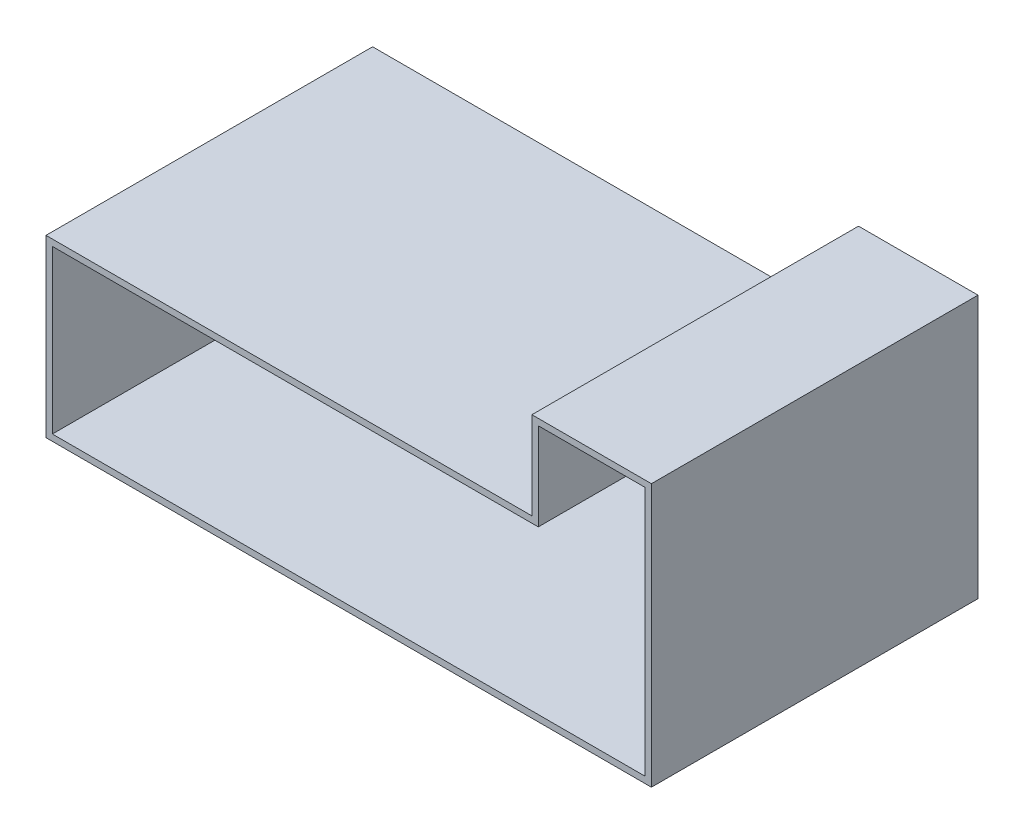
ISO-10303-21;
HEADER;
FILE_DESCRIPTION(('STEP AP214'),'2;1');
FILE_NAME('part.step','',(''),(''),'','','');
FILE_SCHEMA(('AUTOMOTIVE_DESIGN { 1 0 10303 214 1 1 1 1 }'));
ENDSEC;
DATA;
#1=APPLICATION_CONTEXT('core data for automotive mechanical design processes');
#2=APPLICATION_PROTOCOL_DEFINITION('international standard','automotive_design',2000,#1);
#3=PRODUCT_CONTEXT('',#1,'mechanical');
#4=PRODUCT('Part','Part','',(#3));
#5=PRODUCT_RELATED_PRODUCT_CATEGORY('part','',(#4));
#6=PRODUCT_DEFINITION_FORMATION('','',#4);
#7=PRODUCT_DEFINITION_CONTEXT('part definition',#1,'design');
#8=PRODUCT_DEFINITION('design','',#6,#7);
#9=PRODUCT_DEFINITION_SHAPE('','',#8);
#10=(LENGTH_UNIT() NAMED_UNIT(*) SI_UNIT(.MILLI.,.METRE.));
#11=(NAMED_UNIT(*) PLANE_ANGLE_UNIT() SI_UNIT($,.RADIAN.));
#12=(NAMED_UNIT(*) SI_UNIT($,.STERADIAN.) SOLID_ANGLE_UNIT());
#13=UNCERTAINTY_MEASURE_WITH_UNIT(LENGTH_MEASURE(1.E-05),#10,'distance_accuracy_value','');
#14=(GEOMETRIC_REPRESENTATION_CONTEXT(3) GLOBAL_UNCERTAINTY_ASSIGNED_CONTEXT((#13)) GLOBAL_UNIT_ASSIGNED_CONTEXT((#10,
#11,#12)) REPRESENTATION_CONTEXT('',''));
#15=CARTESIAN_POINT('',(0.,0.,0.));
#16=DIRECTION('',(0.,0.,1.));
#17=DIRECTION('',(1.,0.,0.));
#18=AXIS2_PLACEMENT_3D('',#15,#16,#17);
#19=CARTESIAN_POINT('',(-515.221238938053,220.,-96.1504424778762));
#20=DIRECTION('',(1.,0.,0.));
#21=DIRECTION('',(0.,0.,-1.));
#22=AXIS2_PLACEMENT_3D('',#19,#20,#21);
#23=PLANE('',#22);
#24=DIRECTION('',(0.,0.,1.));
#25=VECTOR('',#24,1.);
#26=CARTESIAN_POINT('',(-515.221238938053,0.,-96.1504424778762));
#27=LINE('',#26,#25);
#28=CARTESIAN_POINT('',(-515.221238938053,0.,-96.1504424778762));
#29=VERTEX_POINT('',#28);
#30=CARTESIAN_POINT('',(-515.221238938053,0.,313.849557522124));
#31=VERTEX_POINT('',#30);
#32=EDGE_CURVE('E217',#29,#31,#27,.T.);
#33=ORIENTED_EDGE('',*,*,#32,.T.);
#34=DIRECTION('',(0.,-1.,0.));
#35=VECTOR('',#34,1.);
#36=CARTESIAN_POINT('',(-515.221238938053,220.,313.849557522124));
#37=LINE('',#36,#35);
#38=CARTESIAN_POINT('',(-515.221238938053,220.,313.849557522124));
#39=VERTEX_POINT('',#38);
#40=EDGE_CURVE('E11',#39,#31,#37,.T.);
#41=ORIENTED_EDGE('',*,*,#40,.F.);
#42=DIRECTION('',(0.,0.,1.));
#43=VECTOR('',#42,1.);
#44=CARTESIAN_POINT('',(-515.221238938053,220.,-96.1504424778762));
#45=LINE('',#44,#43);
#46=CARTESIAN_POINT('',(-515.221238938053,220.,-96.1504424778762));
#47=VERTEX_POINT('',#46);
#48=EDGE_CURVE('E218',#47,#39,#45,.T.);
#49=ORIENTED_EDGE('',*,*,#48,.F.);
#50=DIRECTION('',(0.,-1.,0.));
#51=VECTOR('',#50,1.);
#52=CARTESIAN_POINT('',(-515.221238938053,220.,-96.1504424778762));
#53=LINE('',#52,#51);
#54=EDGE_CURVE('E46',#47,#29,#53,.T.);
#55=ORIENTED_EDGE('',*,*,#54,.T.);
#56=EDGE_LOOP('',(#33,#41,#49,#55));
#57=FACE_BOUND('',#56,.T.);
#58=ADVANCED_FACE('F38',(#57),#23,.F.);
#59=CARTESIAN_POINT('',(-515.221238938053,220.,313.849557522124));
#60=DIRECTION('',(0.,0.,-1.));
#61=DIRECTION('',(-1.,0.,0.));
#62=AXIS2_PLACEMENT_3D('',#59,#60,#61);
#63=PLANE('',#62);
#64=DIRECTION('',(-1.,0.,0.));
#65=VECTOR('',#64,1.);
#66=CARTESIAN_POINT('',(-507.221238938053,212.,313.849557522124));
#67=LINE('',#66,#65);
#68=CARTESIAN_POINT('',(102.778761061947,212.,313.849557522124));
#69=VERTEX_POINT('',#68);
#70=CARTESIAN_POINT('',(-507.221238938053,212.,313.849557522124));
#71=VERTEX_POINT('',#70);
#72=EDGE_CURVE('E181',#69,#71,#67,.T.);
#73=ORIENTED_EDGE('',*,*,#72,.F.);
#74=DIRECTION('',(0.,-1.,0.));
#75=VECTOR('',#74,1.);
#76=CARTESIAN_POINT('',(102.778761061947,322.,313.849557522124));
#77=LINE('',#76,#75);
#78=CARTESIAN_POINT('',(102.778761061947,322.,313.849557522124));
#79=VERTEX_POINT('',#78);
#80=EDGE_CURVE('E144',#79,#69,#77,.T.);
#81=ORIENTED_EDGE('',*,*,#80,.F.);
#82=DIRECTION('',(-1.,0.,0.));
#83=VECTOR('',#82,1.);
#84=CARTESIAN_POINT('',(102.778761061947,322.,313.849557522124));
#85=LINE('',#84,#83);
#86=CARTESIAN_POINT('',(236.778761061947,322.,313.849557522124));
#87=VERTEX_POINT('',#86);
#88=EDGE_CURVE('E159',#87,#79,#85,.T.);
#89=ORIENTED_EDGE('',*,*,#88,.F.);
#90=DIRECTION('',(0.,1.,0.));
#91=VECTOR('',#90,1.);
#92=CARTESIAN_POINT('',(236.778761061947,212.,313.849557522124));
#93=LINE('',#92,#91);
#94=CARTESIAN_POINT('',(236.778761061947,8.00000000000001,313.849557522124));
#95=VERTEX_POINT('',#94);
#96=EDGE_CURVE('E307',#95,#87,#93,.T.);
#97=ORIENTED_EDGE('',*,*,#96,.F.);
#98=DIRECTION('',(1.,0.,0.));
#99=VECTOR('',#98,1.);
#100=CARTESIAN_POINT('',(-507.221238938053,8.00000000000001,313.849557522124));
#101=LINE('',#100,#99);
#102=CARTESIAN_POINT('',(-507.221238938053,8.00000000000001,313.849557522124));
#103=VERTEX_POINT('',#102);
#104=EDGE_CURVE('E177',#103,#95,#101,.T.);
#105=ORIENTED_EDGE('',*,*,#104,.F.);
#106=DIRECTION('',(0.,-1.,0.));
#107=VECTOR('',#106,1.);
#108=CARTESIAN_POINT('',(-507.221238938053,212.,313.849557522124));
#109=LINE('',#108,#107);
#110=EDGE_CURVE('E53',#71,#103,#109,.T.);
#111=ORIENTED_EDGE('',*,*,#110,.F.);
#112=EDGE_LOOP('',(#73,#81,#89,#97,#105,#111));
#113=FACE_BOUND('',#112,.T.);
#114=DIRECTION('',(1.,0.,0.));
#115=VECTOR('',#114,1.);
#116=CARTESIAN_POINT('',(-515.221238938053,0.,313.849557522124));
#117=LINE('',#116,#115);
#118=CARTESIAN_POINT('',(244.778761061947,0.,313.849557522124));
#119=VERTEX_POINT('',#118);
#120=EDGE_CURVE('E231',#31,#119,#117,.T.);
#121=ORIENTED_EDGE('',*,*,#120,.T.);
#122=DIRECTION('',(0.,-1.,0.));
#123=VECTOR('',#122,1.);
#124=CARTESIAN_POINT('',(244.778761061947,330.,313.849557522124));
#125=LINE('',#124,#123);
#126=CARTESIAN_POINT('',(244.778761061947,330.,313.849557522124));
#127=VERTEX_POINT('',#126);
#128=EDGE_CURVE('E187',#127,#119,#125,.T.);
#129=ORIENTED_EDGE('',*,*,#128,.F.);
#130=DIRECTION('',(-1.,0.,0.));
#131=VECTOR('',#130,1.);
#132=CARTESIAN_POINT('',(244.778761061947,330.,313.849557522124));
#133=LINE('',#132,#131);
#134=CARTESIAN_POINT('',(94.7787610619469,330.,313.849557522124));
#135=VERTEX_POINT('',#134);
#136=EDGE_CURVE('E202',#127,#135,#133,.T.);
#137=ORIENTED_EDGE('',*,*,#136,.T.);
#138=DIRECTION('',(0.,-1.,0.));
#139=VECTOR('',#138,1.);
#140=CARTESIAN_POINT('',(94.7787610619469,330.,313.849557522124));
#141=LINE('',#140,#139);
#142=CARTESIAN_POINT('',(94.7787610619469,220.,313.849557522124));
#143=VERTEX_POINT('',#142);
#144=EDGE_CURVE('E185',#135,#143,#141,.T.);
#145=ORIENTED_EDGE('',*,*,#144,.T.);
#146=DIRECTION('',(1.,0.,0.));
#147=VECTOR('',#146,1.);
#148=CARTESIAN_POINT('',(-515.221238938053,220.,313.849557522124));
#149=LINE('',#148,#147);
#150=EDGE_CURVE('E83',#39,#143,#149,.T.);
#151=ORIENTED_EDGE('',*,*,#150,.F.);
#152=ORIENTED_EDGE('',*,*,#40,.T.);
#153=EDGE_LOOP('',(#121,#129,#137,#145,#151,#152));
#154=FACE_BOUND('',#153,.T.);
#155=ADVANCED_FACE('F244',(#113,#154),#63,.F.);
#156=CARTESIAN_POINT('',(-515.221238938053,220.,-96.1504424778762));
#157=DIRECTION('',(0.,0.,1.));
#158=DIRECTION('',(1.,0.,0.));
#159=AXIS2_PLACEMENT_3D('',#156,#157,#158);
#160=PLANE('',#159);
#161=DIRECTION('',(-1.,0.,0.));
#162=VECTOR('',#161,1.);
#163=CARTESIAN_POINT('',(-515.221238938053,0.,-96.1504424778762));
#164=LINE('',#163,#162);
#165=CARTESIAN_POINT('',(244.778761061947,0.,-96.1504424778762));
#166=VERTEX_POINT('',#165);
#167=EDGE_CURVE('E77',#166,#29,#164,.T.);
#168=ORIENTED_EDGE('',*,*,#167,.T.);
#169=ORIENTED_EDGE('',*,*,#54,.F.);
#170=DIRECTION('',(-1.,0.,0.));
#171=VECTOR('',#170,1.);
#172=CARTESIAN_POINT('',(-515.221238938053,220.,-96.1504424778762));
#173=LINE('',#172,#171);
#174=CARTESIAN_POINT('',(94.7787610619469,220.,-96.1504424778762));
#175=VERTEX_POINT('',#174);
#176=EDGE_CURVE('E62',#175,#47,#173,.T.);
#177=ORIENTED_EDGE('',*,*,#176,.F.);
#178=DIRECTION('',(0.,1.,0.));
#179=VECTOR('',#178,1.);
#180=CARTESIAN_POINT('',(94.7787610619469,330.,-96.1504424778761));
#181=LINE('',#180,#179);
#182=CARTESIAN_POINT('',(94.7787610619469,330.,-96.1504424778761));
#183=VERTEX_POINT('',#182);
#184=EDGE_CURVE('E205',#175,#183,#181,.T.);
#185=ORIENTED_EDGE('',*,*,#184,.T.);
#186=DIRECTION('',(-1.,0.,0.));
#187=VECTOR('',#186,1.);
#188=CARTESIAN_POINT('',(244.778761061947,330.,-96.1504424778761));
#189=LINE('',#188,#187);
#190=CARTESIAN_POINT('',(244.778761061947,330.,-96.1504424778761));
#191=VERTEX_POINT('',#190);
#192=EDGE_CURVE('E213',#191,#183,#189,.T.);
#193=ORIENTED_EDGE('',*,*,#192,.F.);
#194=DIRECTION('',(0.,1.,0.));
#195=VECTOR('',#194,1.);
#196=CARTESIAN_POINT('',(244.778761061947,330.,-96.1504424778761));
#197=LINE('',#196,#195);
#198=EDGE_CURVE('E196',#166,#191,#197,.T.);
#199=ORIENTED_EDGE('',*,*,#198,.F.);
#200=EDGE_LOOP('',(#168,#169,#177,#185,#193,#199));
#201=FACE_BOUND('',#200,.T.);
#202=ADVANCED_FACE('F246',(#201),#160,.F.);
#203=CARTESIAN_POINT('',(0.,220.,0.));
#204=DIRECTION('',(0.,1.,0.));
#205=DIRECTION('',(0.,0.,1.));
#206=AXIS2_PLACEMENT_3D('',#203,#204,#205);
#207=PLANE('',#206);
#208=ORIENTED_EDGE('',*,*,#48,.T.);
#209=ORIENTED_EDGE('',*,*,#150,.T.);
#210=DIRECTION('',(0.,0.,-1.));
#211=VECTOR('',#210,1.);
#212=CARTESIAN_POINT('',(94.7787610619469,220.,-96.1504424778762));
#213=LINE('',#212,#211);
#214=EDGE_CURVE('E223',#143,#175,#213,.T.);
#215=ORIENTED_EDGE('',*,*,#214,.T.);
#216=ORIENTED_EDGE('',*,*,#176,.T.);
#217=EDGE_LOOP('',(#208,#209,#215,#216));
#218=FACE_BOUND('',#217,.T.);
#219=ADVANCED_FACE('F252',(#218),#207,.T.);
#220=CARTESIAN_POINT('',(0.,0.,0.));
#221=DIRECTION('',(0.,1.,0.));
#222=DIRECTION('',(0.,0.,1.));
#223=AXIS2_PLACEMENT_3D('',#220,#221,#222);
#224=PLANE('',#223);
#225=ORIENTED_EDGE('',*,*,#32,.F.);
#226=ORIENTED_EDGE('',*,*,#167,.F.);
#227=DIRECTION('',(0.,0.,-1.));
#228=VECTOR('',#227,1.);
#229=CARTESIAN_POINT('',(244.778761061947,0.,313.849557522124));
#230=LINE('',#229,#228);
#231=EDGE_CURVE('E191',#119,#166,#230,.T.);
#232=ORIENTED_EDGE('',*,*,#231,.F.);
#233=ORIENTED_EDGE('',*,*,#120,.F.);
#234=EDGE_LOOP('',(#225,#226,#232,#233));
#235=FACE_BOUND('',#234,.T.);
#236=ADVANCED_FACE('F241',(#235),#224,.F.);
#237=CARTESIAN_POINT('',(244.778761061947,330.,313.849557522124));
#238=DIRECTION('',(0.,-1.,0.));
#239=DIRECTION('',(0.,0.,-1.));
#240=AXIS2_PLACEMENT_3D('',#237,#238,#239);
#241=PLANE('',#240);
#242=DIRECTION('',(0.,0.,1.));
#243=VECTOR('',#242,1.);
#244=CARTESIAN_POINT('',(94.7787610619469,330.,313.849557522124));
#245=LINE('',#244,#243);
#246=EDGE_CURVE('E192',#183,#135,#245,.T.);
#247=ORIENTED_EDGE('',*,*,#246,.T.);
#248=ORIENTED_EDGE('',*,*,#136,.F.);
#249=DIRECTION('',(0.,0.,1.));
#250=VECTOR('',#249,1.);
#251=CARTESIAN_POINT('',(244.778761061947,330.,313.849557522124));
#252=LINE('',#251,#250);
#253=EDGE_CURVE('E199',#191,#127,#252,.T.);
#254=ORIENTED_EDGE('',*,*,#253,.F.);
#255=ORIENTED_EDGE('',*,*,#192,.T.);
#256=EDGE_LOOP('',(#247,#248,#254,#255));
#257=FACE_BOUND('',#256,.T.);
#258=ADVANCED_FACE('F257',(#257),#241,.F.);
#259=CARTESIAN_POINT('',(244.778761061947,0.,0.));
#260=DIRECTION('',(1.,0.,0.));
#261=DIRECTION('',(0.,0.,-1.));
#262=AXIS2_PLACEMENT_3D('',#259,#260,#261);
#263=PLANE('',#262);
#264=ORIENTED_EDGE('',*,*,#128,.T.);
#265=ORIENTED_EDGE('',*,*,#231,.T.);
#266=ORIENTED_EDGE('',*,*,#198,.T.);
#267=ORIENTED_EDGE('',*,*,#253,.T.);
#268=EDGE_LOOP('',(#264,#265,#266,#267));
#269=FACE_BOUND('',#268,.T.);
#270=ADVANCED_FACE('F262',(#269),#263,.T.);
#271=CARTESIAN_POINT('',(94.7787610619469,0.,0.));
#272=DIRECTION('',(1.,0.,0.));
#273=DIRECTION('',(0.,0.,-1.));
#274=AXIS2_PLACEMENT_3D('',#271,#272,#273);
#275=PLANE('',#274);
#276=ORIENTED_EDGE('',*,*,#214,.F.);
#277=ORIENTED_EDGE('',*,*,#144,.F.);
#278=ORIENTED_EDGE('',*,*,#246,.F.);
#279=ORIENTED_EDGE('',*,*,#184,.F.);
#280=EDGE_LOOP('',(#276,#277,#278,#279));
#281=FACE_BOUND('',#280,.T.);
#282=ADVANCED_FACE('F264',(#281),#275,.F.);
#283=CARTESIAN_POINT('',(-507.221238938053,212.,-88.1504424778762));
#284=DIRECTION('',(-1.,0.,0.));
#285=DIRECTION('',(0.,0.,1.));
#286=AXIS2_PLACEMENT_3D('',#283,#284,#285);
#287=PLANE('',#286);
#288=ORIENTED_EDGE('',*,*,#110,.T.);
#289=DIRECTION('',(0.,0.,1.));
#290=VECTOR('',#289,1.);
#291=CARTESIAN_POINT('',(-507.221238938053,8.00000000000001,-88.1504424778762));
#292=LINE('',#291,#290);
#293=CARTESIAN_POINT('',(-507.221238938053,8.00000000000001,-88.1504424778762));
#294=VERTEX_POINT('',#293);
#295=EDGE_CURVE('E165',#294,#103,#292,.T.);
#296=ORIENTED_EDGE('',*,*,#295,.F.);
#297=DIRECTION('',(0.,-1.,0.));
#298=VECTOR('',#297,1.);
#299=CARTESIAN_POINT('',(-507.221238938053,212.,-88.1504424778762));
#300=LINE('',#299,#298);
#301=CARTESIAN_POINT('',(-507.221238938053,212.,-88.1504424778762));
#302=VERTEX_POINT('',#301);
#303=EDGE_CURVE('E171',#302,#294,#300,.T.);
#304=ORIENTED_EDGE('',*,*,#303,.F.);
#305=DIRECTION('',(0.,0.,1.));
#306=VECTOR('',#305,1.);
#307=CARTESIAN_POINT('',(-507.221238938053,212.,-88.1504424778762));
#308=LINE('',#307,#306);
#309=EDGE_CURVE('E162',#302,#71,#308,.T.);
#310=ORIENTED_EDGE('',*,*,#309,.T.);
#311=EDGE_LOOP('',(#288,#296,#304,#310));
#312=FACE_BOUND('',#311,.T.);
#313=ADVANCED_FACE('F267',(#312),#287,.F.);
#314=CARTESIAN_POINT('',(-507.221238938053,212.,-88.1504424778762));
#315=DIRECTION('',(0.,1.,0.));
#316=DIRECTION('',(-1.,0.,0.));
#317=AXIS2_PLACEMENT_3D('',#314,#315,#316);
#318=PLANE('',#317);
#319=DIRECTION('',(-1.,0.,0.));
#320=VECTOR('',#319,1.);
#321=CARTESIAN_POINT('',(-507.221238938053,212.,-88.1504424778762));
#322=LINE('',#321,#320);
#323=CARTESIAN_POINT('',(102.778761061947,212.,-88.1504424778762));
#324=VERTEX_POINT('',#323);
#325=EDGE_CURVE('E155',#324,#302,#322,.T.);
#326=ORIENTED_EDGE('',*,*,#325,.F.);
#327=DIRECTION('',(0.,0.,1.));
#328=VECTOR('',#327,1.);
#329=CARTESIAN_POINT('',(102.778761061947,212.,-88.1504424778762));
#330=LINE('',#329,#328);
#331=EDGE_CURVE('E138',#324,#69,#330,.T.);
#332=ORIENTED_EDGE('',*,*,#331,.T.);
#333=ORIENTED_EDGE('',*,*,#72,.T.);
#334=ORIENTED_EDGE('',*,*,#309,.F.);
#335=EDGE_LOOP('',(#326,#332,#333,#334));
#336=FACE_BOUND('',#335,.T.);
#337=ADVANCED_FACE('F161',(#336),#318,.F.);
#338=CARTESIAN_POINT('',(-507.221238938053,8.00000000000001,-88.1504424778762));
#339=DIRECTION('',(0.,-1.,0.));
#340=DIRECTION('',(0.,0.,-1.));
#341=AXIS2_PLACEMENT_3D('',#338,#339,#340);
#342=PLANE('',#341);
#343=ORIENTED_EDGE('',*,*,#104,.T.);
#344=DIRECTION('',(0.,0.,1.));
#345=VECTOR('',#344,1.);
#346=CARTESIAN_POINT('',(236.778761061947,8.00000000000001,-88.1504424778762));
#347=LINE('',#346,#345);
#348=CARTESIAN_POINT('',(236.778761061947,8.00000000000001,-88.1504424778762));
#349=VERTEX_POINT('',#348);
#350=EDGE_CURVE('E178',#349,#95,#347,.T.);
#351=ORIENTED_EDGE('',*,*,#350,.F.);
#352=DIRECTION('',(1.,0.,0.));
#353=VECTOR('',#352,1.);
#354=CARTESIAN_POINT('',(-507.221238938053,8.00000000000001,-88.1504424778762));
#355=LINE('',#354,#353);
#356=EDGE_CURVE('E166',#294,#349,#355,.T.);
#357=ORIENTED_EDGE('',*,*,#356,.F.);
#358=ORIENTED_EDGE('',*,*,#295,.T.);
#359=EDGE_LOOP('',(#343,#351,#357,#358));
#360=FACE_BOUND('',#359,.T.);
#361=ADVANCED_FACE('F274',(#360),#342,.F.);
#362=CARTESIAN_POINT('',(0.,0.,-88.1504424778762));
#363=DIRECTION('',(0.,0.,1.));
#364=DIRECTION('',(1.,0.,0.));
#365=AXIS2_PLACEMENT_3D('',#362,#363,#364);
#366=PLANE('',#365);
#367=ORIENTED_EDGE('',*,*,#303,.T.);
#368=ORIENTED_EDGE('',*,*,#356,.T.);
#369=DIRECTION('',(0.,1.,0.));
#370=VECTOR('',#369,1.);
#371=CARTESIAN_POINT('',(236.778761061947,212.,-88.1504424778762));
#372=LINE('',#371,#370);
#373=CARTESIAN_POINT('',(236.778761061947,322.,-88.1504424778762));
#374=VERTEX_POINT('',#373);
#375=EDGE_CURVE('E310',#349,#374,#372,.T.);
#376=ORIENTED_EDGE('',*,*,#375,.T.);
#377=DIRECTION('',(-1.,0.,0.));
#378=VECTOR('',#377,1.);
#379=CARTESIAN_POINT('',(102.778761061947,322.,-88.1504424778762));
#380=LINE('',#379,#378);
#381=CARTESIAN_POINT('',(102.778761061947,322.,-88.1504424778762));
#382=VERTEX_POINT('',#381);
#383=EDGE_CURVE('E150',#374,#382,#380,.T.);
#384=ORIENTED_EDGE('',*,*,#383,.T.);
#385=DIRECTION('',(0.,-1.,0.));
#386=VECTOR('',#385,1.);
#387=CARTESIAN_POINT('',(102.778761061947,322.,-88.1504424778762));
#388=LINE('',#387,#386);
#389=EDGE_CURVE('E141',#382,#324,#388,.T.);
#390=ORIENTED_EDGE('',*,*,#389,.T.);
#391=ORIENTED_EDGE('',*,*,#325,.T.);
#392=EDGE_LOOP('',(#367,#368,#376,#384,#390,#391));
#393=FACE_BOUND('',#392,.T.);
#394=ADVANCED_FACE('F154',(#393),#366,.T.);
#395=CARTESIAN_POINT('',(236.778761061947,212.,-88.1504424778762));
#396=DIRECTION('',(1.,0.,0.));
#397=DIRECTION('',(0.,1.,0.));
#398=AXIS2_PLACEMENT_3D('',#395,#396,#397);
#399=PLANE('',#398);
#400=ORIENTED_EDGE('',*,*,#96,.T.);
#401=DIRECTION('',(0.,0.,1.));
#402=VECTOR('',#401,1.);
#403=CARTESIAN_POINT('',(236.778761061947,322.,-88.1504424778762));
#404=LINE('',#403,#402);
#405=EDGE_CURVE('E149',#374,#87,#404,.T.);
#406=ORIENTED_EDGE('',*,*,#405,.F.);
#407=ORIENTED_EDGE('',*,*,#375,.F.);
#408=ORIENTED_EDGE('',*,*,#350,.T.);
#409=EDGE_LOOP('',(#400,#406,#407,#408));
#410=FACE_BOUND('',#409,.T.);
#411=ADVANCED_FACE('F282',(#410),#399,.F.);
#412=CARTESIAN_POINT('',(102.778761061947,322.,-88.1504424778762));
#413=DIRECTION('',(-1.,0.,0.));
#414=DIRECTION('',(0.,-1.,0.));
#415=AXIS2_PLACEMENT_3D('',#412,#413,#414);
#416=PLANE('',#415);
#417=ORIENTED_EDGE('',*,*,#80,.T.);
#418=ORIENTED_EDGE('',*,*,#331,.F.);
#419=ORIENTED_EDGE('',*,*,#389,.F.);
#420=DIRECTION('',(0.,0.,1.));
#421=VECTOR('',#420,1.);
#422=CARTESIAN_POINT('',(102.778761061947,322.,-88.1504424778762));
#423=LINE('',#422,#421);
#424=EDGE_CURVE('E296',#382,#79,#423,.T.);
#425=ORIENTED_EDGE('',*,*,#424,.T.);
#426=EDGE_LOOP('',(#417,#418,#419,#425));
#427=FACE_BOUND('',#426,.T.);
#428=ADVANCED_FACE('F140',(#427),#416,.F.);
#429=CARTESIAN_POINT('',(102.778761061947,322.,-88.1504424778762));
#430=DIRECTION('',(0.,1.,0.));
#431=DIRECTION('',(-1.,0.,0.));
#432=AXIS2_PLACEMENT_3D('',#429,#430,#431);
#433=PLANE('',#432);
#434=ORIENTED_EDGE('',*,*,#88,.T.);
#435=ORIENTED_EDGE('',*,*,#424,.F.);
#436=ORIENTED_EDGE('',*,*,#383,.F.);
#437=ORIENTED_EDGE('',*,*,#405,.T.);
#438=EDGE_LOOP('',(#434,#435,#436,#437));
#439=FACE_BOUND('',#438,.T.);
#440=ADVANCED_FACE('F288',(#439),#433,.F.);
#441=CLOSED_SHELL('',(#58,#155,#202,#219,#236,#258,#270,#282,#313,#337,#361,#394,#411,#428,#440));
#442=MANIFOLD_SOLID_BREP('B2',#441);
#443=ADVANCED_BREP_SHAPE_REPRESENTATION('',(#18,#442),#14);
#444=SHAPE_DEFINITION_REPRESENTATION(#9,#443);
ENDSEC;
END-ISO-10303-21;
